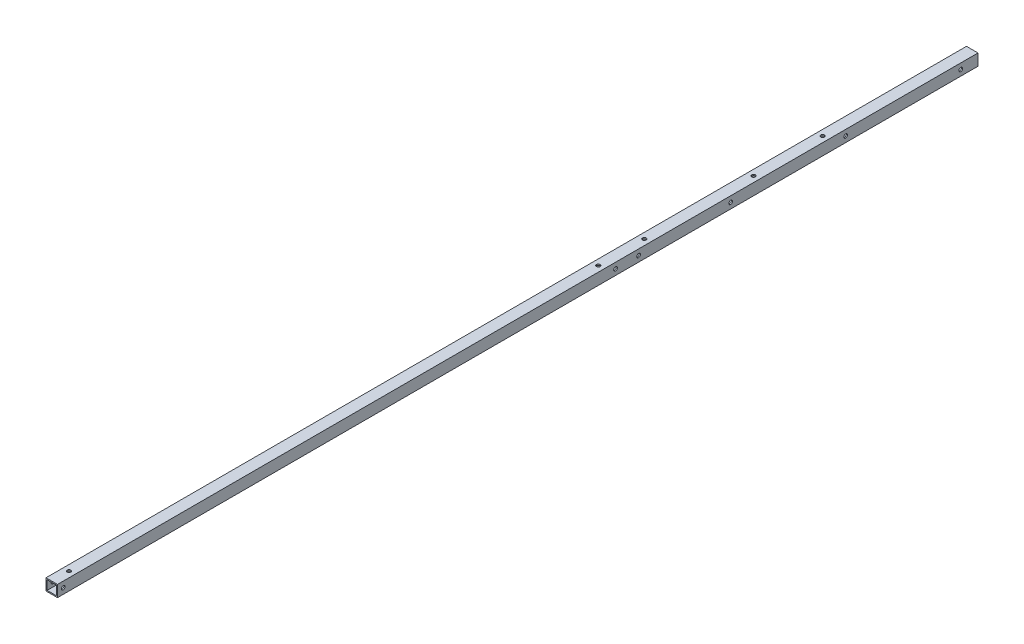
ISO-10303-21;
HEADER;
FILE_DESCRIPTION(('STEP AP214'),'2;1');
FILE_NAME('part.step','',(''),(''),'','','');
FILE_SCHEMA(('AUTOMOTIVE_DESIGN { 1 0 10303 214 1 1 1 1 }'));
ENDSEC;
DATA;
#1=APPLICATION_CONTEXT('core data for automotive mechanical design processes');
#2=APPLICATION_PROTOCOL_DEFINITION('international standard','automotive_design',2000,#1);
#3=PRODUCT_CONTEXT('',#1,'mechanical');
#4=PRODUCT('Part','Part','',(#3));
#5=PRODUCT_RELATED_PRODUCT_CATEGORY('part','',(#4));
#6=PRODUCT_DEFINITION_FORMATION('','',#4);
#7=PRODUCT_DEFINITION_CONTEXT('part definition',#1,'design');
#8=PRODUCT_DEFINITION('design','',#6,#7);
#9=PRODUCT_DEFINITION_SHAPE('','',#8);
#10=(LENGTH_UNIT() NAMED_UNIT(*) SI_UNIT(.MILLI.,.METRE.));
#11=(NAMED_UNIT(*) PLANE_ANGLE_UNIT() SI_UNIT($,.RADIAN.));
#12=(NAMED_UNIT(*) SI_UNIT($,.STERADIAN.) SOLID_ANGLE_UNIT());
#13=UNCERTAINTY_MEASURE_WITH_UNIT(LENGTH_MEASURE(1.E-05),#10,'distance_accuracy_value','');
#14=(GEOMETRIC_REPRESENTATION_CONTEXT(3) GLOBAL_UNCERTAINTY_ASSIGNED_CONTEXT((#13)) GLOBAL_UNIT_ASSIGNED_CONTEXT((#10,
#11,#12)) REPRESENTATION_CONTEXT('',''));
#15=CARTESIAN_POINT('',(0.,0.,0.));
#16=DIRECTION('',(0.,0.,1.));
#17=DIRECTION('',(1.,0.,0.));
#18=AXIS2_PLACEMENT_3D('',#15,#16,#17);
#19=CARTESIAN_POINT('',(0.,0.,800.));
#20=DIRECTION('',(0.,0.,-1.));
#21=DIRECTION('',(-1.,0.,0.));
#22=AXIS2_PLACEMENT_3D('',#19,#20,#21);
#23=PLANE('',#22);
#24=DIRECTION('',(0.,1.,0.));
#25=VECTOR('',#24,1.);
#26=CARTESIAN_POINT('',(5.,-5.,800.));
#27=LINE('',#26,#25);
#28=CARTESIAN_POINT('',(5.,-5.,800.));
#29=VERTEX_POINT('',#28);
#30=CARTESIAN_POINT('',(5.,5.,800.));
#31=VERTEX_POINT('',#30);
#32=EDGE_CURVE('E140',#29,#31,#27,.T.);
#33=ORIENTED_EDGE('',*,*,#32,.T.);
#34=DIRECTION('',(-1.,0.,0.));
#35=VECTOR('',#34,1.);
#36=CARTESIAN_POINT('',(-5.,5.,800.));
#37=LINE('',#36,#35);
#38=CARTESIAN_POINT('',(-5.,5.,800.));
#39=VERTEX_POINT('',#38);
#40=EDGE_CURVE('E143',#31,#39,#37,.T.);
#41=ORIENTED_EDGE('',*,*,#40,.T.);
#42=DIRECTION('',(0.,-1.,0.));
#43=VECTOR('',#42,1.);
#44=CARTESIAN_POINT('',(-5.,-5.,800.));
#45=LINE('',#44,#43);
#46=CARTESIAN_POINT('',(-5.,-5.,800.));
#47=VERTEX_POINT('',#46);
#48=EDGE_CURVE('E146',#39,#47,#45,.T.);
#49=ORIENTED_EDGE('',*,*,#48,.T.);
#50=DIRECTION('',(1.,0.,0.));
#51=VECTOR('',#50,1.);
#52=CARTESIAN_POINT('',(-5.,-5.,800.));
#53=LINE('',#52,#51);
#54=EDGE_CURVE('E148',#47,#29,#53,.T.);
#55=ORIENTED_EDGE('',*,*,#54,.T.);
#56=EDGE_LOOP('',(#33,#41,#49,#55));
#57=FACE_BOUND('',#56,.T.);
#58=DIRECTION('',(0.,1.,0.));
#59=VECTOR('',#58,1.);
#60=CARTESIAN_POINT('',(4.,-4.,800.));
#61=LINE('',#60,#59);
#62=CARTESIAN_POINT('',(4.,-4.,800.));
#63=VERTEX_POINT('',#62);
#64=CARTESIAN_POINT('',(4.,4.,800.));
#65=VERTEX_POINT('',#64);
#66=EDGE_CURVE('E102',#63,#65,#61,.T.);
#67=ORIENTED_EDGE('',*,*,#66,.F.);
#68=DIRECTION('',(1.,0.,0.));
#69=VECTOR('',#68,1.);
#70=CARTESIAN_POINT('',(-4.,-4.,800.));
#71=LINE('',#70,#69);
#72=CARTESIAN_POINT('',(-4.,-4.,800.));
#73=VERTEX_POINT('',#72);
#74=EDGE_CURVE('E124',#73,#63,#71,.T.);
#75=ORIENTED_EDGE('',*,*,#74,.F.);
#76=DIRECTION('',(0.,-1.,0.));
#77=VECTOR('',#76,1.);
#78=CARTESIAN_POINT('',(-4.,-4.,800.));
#79=LINE('',#78,#77);
#80=CARTESIAN_POINT('',(-4.,4.,800.));
#81=VERTEX_POINT('',#80);
#82=EDGE_CURVE('E122',#81,#73,#79,.T.);
#83=ORIENTED_EDGE('',*,*,#82,.F.);
#84=DIRECTION('',(-1.,0.,0.));
#85=VECTOR('',#84,1.);
#86=CARTESIAN_POINT('',(-4.,4.,800.));
#87=LINE('',#86,#85);
#88=EDGE_CURVE('E110',#65,#81,#87,.T.);
#89=ORIENTED_EDGE('',*,*,#88,.F.);
#90=EDGE_LOOP('',(#67,#75,#83,#89));
#91=FACE_BOUND('',#90,.T.);
#92=ADVANCED_FACE('F35',(#57,#91),#23,.F.);
#93=CARTESIAN_POINT('',(0.,0.,0.));
#94=DIRECTION('',(0.,0.,-1.));
#95=DIRECTION('',(-1.,0.,0.));
#96=AXIS2_PLACEMENT_3D('',#93,#94,#95);
#97=PLANE('',#96);
#98=DIRECTION('',(0.,1.,0.));
#99=VECTOR('',#98,1.);
#100=CARTESIAN_POINT('',(5.,-5.,0.));
#101=LINE('',#100,#99);
#102=CARTESIAN_POINT('',(5.,-5.,0.));
#103=VERTEX_POINT('',#102);
#104=CARTESIAN_POINT('',(5.,5.,0.));
#105=VERTEX_POINT('',#104);
#106=EDGE_CURVE('E118',#103,#105,#101,.T.);
#107=ORIENTED_EDGE('',*,*,#106,.F.);
#108=DIRECTION('',(1.,0.,0.));
#109=VECTOR('',#108,1.);
#110=CARTESIAN_POINT('',(-5.,-5.,0.));
#111=LINE('',#110,#109);
#112=CARTESIAN_POINT('',(-5.,-5.,0.));
#113=VERTEX_POINT('',#112);
#114=EDGE_CURVE('E144',#113,#103,#111,.T.);
#115=ORIENTED_EDGE('',*,*,#114,.F.);
#116=DIRECTION('',(0.,-1.,0.));
#117=VECTOR('',#116,1.);
#118=CARTESIAN_POINT('',(-5.,-5.,0.));
#119=LINE('',#118,#117);
#120=CARTESIAN_POINT('',(-5.,5.,0.));
#121=VERTEX_POINT('',#120);
#122=EDGE_CURVE('E155',#121,#113,#119,.T.);
#123=ORIENTED_EDGE('',*,*,#122,.F.);
#124=DIRECTION('',(-1.,0.,0.));
#125=VECTOR('',#124,1.);
#126=CARTESIAN_POINT('',(-5.,5.,0.));
#127=LINE('',#126,#125);
#128=EDGE_CURVE('E153',#105,#121,#127,.T.);
#129=ORIENTED_EDGE('',*,*,#128,.F.);
#130=EDGE_LOOP('',(#107,#115,#123,#129));
#131=FACE_BOUND('',#130,.T.);
#132=DIRECTION('',(1.,0.,0.));
#133=VECTOR('',#132,1.);
#134=CARTESIAN_POINT('',(-4.,-4.,0.));
#135=LINE('',#134,#133);
#136=CARTESIAN_POINT('',(-4.,-4.,0.));
#137=VERTEX_POINT('',#136);
#138=CARTESIAN_POINT('',(4.,-4.,0.));
#139=VERTEX_POINT('',#138);
#140=EDGE_CURVE('E111',#137,#139,#135,.T.);
#141=ORIENTED_EDGE('',*,*,#140,.T.);
#142=DIRECTION('',(0.,1.,0.));
#143=VECTOR('',#142,1.);
#144=CARTESIAN_POINT('',(4.,-4.,0.));
#145=LINE('',#144,#143);
#146=CARTESIAN_POINT('',(4.,4.,0.));
#147=VERTEX_POINT('',#146);
#148=EDGE_CURVE('E60',#139,#147,#145,.T.);
#149=ORIENTED_EDGE('',*,*,#148,.T.);
#150=DIRECTION('',(-1.,0.,0.));
#151=VECTOR('',#150,1.);
#152=CARTESIAN_POINT('',(-4.,4.,0.));
#153=LINE('',#152,#151);
#154=CARTESIAN_POINT('',(-4.,4.,0.));
#155=VERTEX_POINT('',#154);
#156=EDGE_CURVE('E117',#147,#155,#153,.T.);
#157=ORIENTED_EDGE('',*,*,#156,.T.);
#158=DIRECTION('',(0.,-1.,0.));
#159=VECTOR('',#158,1.);
#160=CARTESIAN_POINT('',(-4.,-4.,0.));
#161=LINE('',#160,#159);
#162=EDGE_CURVE('E132',#155,#137,#161,.T.);
#163=ORIENTED_EDGE('',*,*,#162,.T.);
#164=EDGE_LOOP('',(#141,#149,#157,#163));
#165=FACE_BOUND('',#164,.T.);
#166=ADVANCED_FACE('F320',(#131,#165),#97,.T.);
#167=CARTESIAN_POINT('',(5.,-5.,800.));
#168=DIRECTION('',(-1.,0.,0.));
#169=DIRECTION('',(0.,0.,1.));
#170=AXIS2_PLACEMENT_3D('',#167,#168,#169);
#171=PLANE('',#170);
#172=CARTESIAN_POINT('',(5.,0.,115.));
#173=DIRECTION('',(1.,0.,0.));
#174=DIRECTION('',(0.,0.,-1.));
#175=AXIS2_PLACEMENT_3D('',#172,#173,#174);
#176=CIRCLE('',#175,1.6);
#177=CARTESIAN_POINT('',(5.,0.,113.4));
#178=VERTEX_POINT('',#177);
#179=EDGE_CURVE('E396',#178,#178,#176,.T.);
#180=ORIENTED_EDGE('',*,*,#179,.F.);
#181=EDGE_LOOP('',(#180));
#182=FACE_BOUND('',#181,.T.);
#183=CARTESIAN_POINT('',(5.,0.,215.));
#184=DIRECTION('',(1.,0.,0.));
#185=DIRECTION('',(0.,0.,-1.));
#186=AXIS2_PLACEMENT_3D('',#183,#184,#185);
#187=CIRCLE('',#186,1.6);
#188=CARTESIAN_POINT('',(5.,0.,213.4));
#189=VERTEX_POINT('',#188);
#190=EDGE_CURVE('E400',#189,#189,#187,.T.);
#191=ORIENTED_EDGE('',*,*,#190,.F.);
#192=EDGE_LOOP('',(#191));
#193=FACE_BOUND('',#192,.T.);
#194=CARTESIAN_POINT('',(5.,0.,315.));
#195=DIRECTION('',(1.,0.,0.));
#196=DIRECTION('',(0.,0.,-1.));
#197=AXIS2_PLACEMENT_3D('',#194,#195,#196);
#198=CIRCLE('',#197,1.6);
#199=CARTESIAN_POINT('',(5.,0.,313.4));
#200=VERTEX_POINT('',#199);
#201=EDGE_CURVE('E215',#200,#200,#198,.T.);
#202=ORIENTED_EDGE('',*,*,#201,.F.);
#203=EDGE_LOOP('',(#202));
#204=FACE_BOUND('',#203,.T.);
#205=CARTESIAN_POINT('',(5.,0.,15.));
#206=DIRECTION('',(1.,0.,0.));
#207=DIRECTION('',(0.,0.,-1.));
#208=AXIS2_PLACEMENT_3D('',#205,#206,#207);
#209=CIRCLE('',#208,1.6);
#210=CARTESIAN_POINT('',(5.,0.,13.4));
#211=VERTEX_POINT('',#210);
#212=EDGE_CURVE('E221',#211,#211,#209,.T.);
#213=ORIENTED_EDGE('',*,*,#212,.F.);
#214=EDGE_LOOP('',(#213));
#215=FACE_BOUND('',#214,.T.);
#216=CARTESIAN_POINT('',(5.,0.,795.));
#217=DIRECTION('',(-1.,0.,0.));
#218=DIRECTION('',(0.,0.,1.));
#219=AXIS2_PLACEMENT_3D('',#216,#217,#218);
#220=CIRCLE('',#219,1.60000000000002);
#221=CARTESIAN_POINT('',(5.,0.,796.6));
#222=VERTEX_POINT('',#221);
#223=EDGE_CURVE('E189',#222,#222,#220,.T.);
#224=ORIENTED_EDGE('',*,*,#223,.T.);
#225=EDGE_LOOP('',(#224));
#226=FACE_BOUND('',#225,.T.);
#227=CARTESIAN_POINT('',(5.,0.,295.));
#228=DIRECTION('',(-1.,0.,0.));
#229=DIRECTION('',(0.,0.,1.));
#230=AXIS2_PLACEMENT_3D('',#227,#228,#229);
#231=CIRCLE('',#230,1.60000000000002);
#232=CARTESIAN_POINT('',(5.,0.,296.6));
#233=VERTEX_POINT('',#232);
#234=EDGE_CURVE('E234',#233,#233,#231,.T.);
#235=ORIENTED_EDGE('',*,*,#234,.T.);
#236=EDGE_LOOP('',(#235));
#237=FACE_BOUND('',#236,.T.);
#238=ORIENTED_EDGE('',*,*,#106,.T.);
#239=DIRECTION('',(0.,0.,-1.));
#240=VECTOR('',#239,1.);
#241=CARTESIAN_POINT('',(5.,5.,800.));
#242=LINE('',#241,#240);
#243=EDGE_CURVE('E11',#31,#105,#242,.T.);
#244=ORIENTED_EDGE('',*,*,#243,.F.);
#245=ORIENTED_EDGE('',*,*,#32,.F.);
#246=DIRECTION('',(0.,0.,-1.));
#247=VECTOR('',#246,1.);
#248=CARTESIAN_POINT('',(5.,-5.,800.));
#249=LINE('',#248,#247);
#250=EDGE_CURVE('E150',#29,#103,#249,.T.);
#251=ORIENTED_EDGE('',*,*,#250,.T.);
#252=EDGE_LOOP('',(#238,#244,#245,#251));
#253=FACE_BOUND('',#252,.T.);
#254=ADVANCED_FACE('F37',(#182,#193,#204,#215,#226,#237,#253),#171,.F.);
#255=CARTESIAN_POINT('',(-5.,5.,800.));
#256=DIRECTION('',(0.,-1.,0.));
#257=DIRECTION('',(0.,0.,-1.));
#258=AXIS2_PLACEMENT_3D('',#255,#256,#257);
#259=PLANE('',#258);
#260=CARTESIAN_POINT('',(0.,5.,785.));
#261=DIRECTION('',(0.,1.,0.));
#262=DIRECTION('',(0.,0.,1.));
#263=AXIS2_PLACEMENT_3D('',#260,#261,#262);
#264=CIRCLE('',#263,1.60000000000004);
#265=CARTESIAN_POINT('',(0.,5.,786.6));
#266=VERTEX_POINT('',#265);
#267=EDGE_CURVE('E246',#266,#266,#264,.T.);
#268=ORIENTED_EDGE('',*,*,#267,.F.);
#269=EDGE_LOOP('',(#268));
#270=FACE_BOUND('',#269,.T.);
#271=CARTESIAN_POINT('',(0.,5.,190.));
#272=DIRECTION('',(0.,1.,0.));
#273=DIRECTION('',(0.,0.,1.));
#274=AXIS2_PLACEMENT_3D('',#271,#272,#273);
#275=CIRCLE('',#274,1.59999999999998);
#276=CARTESIAN_POINT('',(0.,5.,191.6));
#277=VERTEX_POINT('',#276);
#278=EDGE_CURVE('E252',#277,#277,#275,.T.);
#279=ORIENTED_EDGE('',*,*,#278,.F.);
#280=EDGE_LOOP('',(#279));
#281=FACE_BOUND('',#280,.T.);
#282=CARTESIAN_POINT('',(0.,5.,130.));
#283=DIRECTION('',(0.,1.,0.));
#284=DIRECTION('',(0.,0.,1.));
#285=AXIS2_PLACEMENT_3D('',#282,#283,#284);
#286=CIRCLE('',#285,1.59999999999999);
#287=CARTESIAN_POINT('',(0.,5.,131.6));
#288=VERTEX_POINT('',#287);
#289=EDGE_CURVE('E258',#288,#288,#286,.T.);
#290=ORIENTED_EDGE('',*,*,#289,.F.);
#291=EDGE_LOOP('',(#290));
#292=FACE_BOUND('',#291,.T.);
#293=CARTESIAN_POINT('',(0.,5.,325.));
#294=DIRECTION('',(0.,1.,0.));
#295=DIRECTION('',(0.,0.,1.));
#296=AXIS2_PLACEMENT_3D('',#293,#294,#295);
#297=CIRCLE('',#296,1.59999999999999);
#298=CARTESIAN_POINT('',(0.,5.,326.6));
#299=VERTEX_POINT('',#298);
#300=EDGE_CURVE('E264',#299,#299,#297,.T.);
#301=ORIENTED_EDGE('',*,*,#300,.F.);
#302=EDGE_LOOP('',(#301));
#303=FACE_BOUND('',#302,.T.);
#304=CARTESIAN_POINT('',(0.,5.,285.));
#305=DIRECTION('',(0.,1.,0.));
#306=DIRECTION('',(0.,0.,1.));
#307=AXIS2_PLACEMENT_3D('',#304,#305,#306);
#308=CIRCLE('',#307,1.59999999999999);
#309=CARTESIAN_POINT('',(0.,5.,286.6));
#310=VERTEX_POINT('',#309);
#311=EDGE_CURVE('E243',#310,#310,#308,.T.);
#312=ORIENTED_EDGE('',*,*,#311,.F.);
#313=EDGE_LOOP('',(#312));
#314=FACE_BOUND('',#313,.T.);
#315=ORIENTED_EDGE('',*,*,#128,.T.);
#316=DIRECTION('',(0.,0.,-1.));
#317=VECTOR('',#316,1.);
#318=CARTESIAN_POINT('',(-5.,5.,800.));
#319=LINE('',#318,#317);
#320=EDGE_CURVE('E44',#39,#121,#319,.T.);
#321=ORIENTED_EDGE('',*,*,#320,.F.);
#322=ORIENTED_EDGE('',*,*,#40,.F.);
#323=ORIENTED_EDGE('',*,*,#243,.T.);
#324=EDGE_LOOP('',(#315,#321,#322,#323));
#325=FACE_BOUND('',#324,.T.);
#326=ADVANCED_FACE('F306',(#270,#281,#292,#303,#314,#325),#259,.F.);
#327=CARTESIAN_POINT('',(-5.,-5.,800.));
#328=DIRECTION('',(1.,0.,0.));
#329=DIRECTION('',(0.,0.,-1.));
#330=AXIS2_PLACEMENT_3D('',#327,#328,#329);
#331=PLANE('',#330);
#332=CARTESIAN_POINT('',(-5.,0.,115.));
#333=DIRECTION('',(1.,0.,0.));
#334=DIRECTION('',(0.,0.,-1.));
#335=AXIS2_PLACEMENT_3D('',#332,#333,#334);
#336=CIRCLE('',#335,1.6);
#337=CARTESIAN_POINT('',(-5.,0.,113.4));
#338=VERTEX_POINT('',#337);
#339=EDGE_CURVE('E202',#338,#338,#336,.T.);
#340=ORIENTED_EDGE('',*,*,#339,.T.);
#341=EDGE_LOOP('',(#340));
#342=FACE_BOUND('',#341,.T.);
#343=CARTESIAN_POINT('',(-5.,0.,215.));
#344=DIRECTION('',(1.,0.,0.));
#345=DIRECTION('',(0.,0.,-1.));
#346=AXIS2_PLACEMENT_3D('',#343,#344,#345);
#347=CIRCLE('',#346,1.6);
#348=CARTESIAN_POINT('',(-5.,0.,213.4));
#349=VERTEX_POINT('',#348);
#350=EDGE_CURVE('E352',#349,#349,#347,.T.);
#351=ORIENTED_EDGE('',*,*,#350,.T.);
#352=EDGE_LOOP('',(#351));
#353=FACE_BOUND('',#352,.T.);
#354=CARTESIAN_POINT('',(-5.,0.,315.));
#355=DIRECTION('',(1.,0.,0.));
#356=DIRECTION('',(0.,0.,-1.));
#357=AXIS2_PLACEMENT_3D('',#354,#355,#356);
#358=CIRCLE('',#357,1.6);
#359=CARTESIAN_POINT('',(-5.,0.,313.4));
#360=VERTEX_POINT('',#359);
#361=EDGE_CURVE('E356',#360,#360,#358,.T.);
#362=ORIENTED_EDGE('',*,*,#361,.T.);
#363=EDGE_LOOP('',(#362));
#364=FACE_BOUND('',#363,.T.);
#365=CARTESIAN_POINT('',(-5.,0.,15.));
#366=DIRECTION('',(1.,0.,0.));
#367=DIRECTION('',(0.,0.,-1.));
#368=AXIS2_PLACEMENT_3D('',#365,#366,#367);
#369=CIRCLE('',#368,1.6);
#370=CARTESIAN_POINT('',(-5.,0.,13.4));
#371=VERTEX_POINT('',#370);
#372=EDGE_CURVE('E198',#371,#371,#369,.T.);
#373=ORIENTED_EDGE('',*,*,#372,.T.);
#374=EDGE_LOOP('',(#373));
#375=FACE_BOUND('',#374,.T.);
#376=CARTESIAN_POINT('',(-5.,0.,795.));
#377=DIRECTION('',(-1.,0.,0.));
#378=DIRECTION('',(0.,0.,1.));
#379=AXIS2_PLACEMENT_3D('',#376,#377,#378);
#380=CIRCLE('',#379,1.60000000000002);
#381=CARTESIAN_POINT('',(-5.,0.,796.6));
#382=VERTEX_POINT('',#381);
#383=EDGE_CURVE('E231',#382,#382,#380,.T.);
#384=ORIENTED_EDGE('',*,*,#383,.F.);
#385=EDGE_LOOP('',(#384));
#386=FACE_BOUND('',#385,.T.);
#387=CARTESIAN_POINT('',(-5.,0.,295.));
#388=DIRECTION('',(-1.,0.,0.));
#389=DIRECTION('',(0.,0.,1.));
#390=AXIS2_PLACEMENT_3D('',#387,#388,#389);
#391=CIRCLE('',#390,1.60000000000002);
#392=CARTESIAN_POINT('',(-5.,0.,296.6));
#393=VERTEX_POINT('',#392);
#394=EDGE_CURVE('E228',#393,#393,#391,.T.);
#395=ORIENTED_EDGE('',*,*,#394,.F.);
#396=EDGE_LOOP('',(#395));
#397=FACE_BOUND('',#396,.T.);
#398=ORIENTED_EDGE('',*,*,#122,.T.);
#399=DIRECTION('',(0.,0.,-1.));
#400=VECTOR('',#399,1.);
#401=CARTESIAN_POINT('',(-5.,-5.,800.));
#402=LINE('',#401,#400);
#403=EDGE_CURVE('E160',#47,#113,#402,.T.);
#404=ORIENTED_EDGE('',*,*,#403,.F.);
#405=ORIENTED_EDGE('',*,*,#48,.F.);
#406=ORIENTED_EDGE('',*,*,#320,.T.);
#407=EDGE_LOOP('',(#398,#404,#405,#406));
#408=FACE_BOUND('',#407,.T.);
#409=ADVANCED_FACE('F309',(#342,#353,#364,#375,#386,#397,#408),#331,.F.);
#410=CARTESIAN_POINT('',(-5.,-5.,800.));
#411=DIRECTION('',(0.,1.,0.));
#412=DIRECTION('',(0.,0.,1.));
#413=AXIS2_PLACEMENT_3D('',#410,#411,#412);
#414=PLANE('',#413);
#415=CARTESIAN_POINT('',(0.,-5.,785.));
#416=DIRECTION('',(0.,1.,0.));
#417=DIRECTION('',(0.,0.,1.));
#418=AXIS2_PLACEMENT_3D('',#415,#416,#417);
#419=CIRCLE('',#418,1.60000000000004);
#420=CARTESIAN_POINT('',(0.,-5.,786.6));
#421=VERTEX_POINT('',#420);
#422=EDGE_CURVE('E169',#421,#421,#419,.T.);
#423=ORIENTED_EDGE('',*,*,#422,.T.);
#424=EDGE_LOOP('',(#423));
#425=FACE_BOUND('',#424,.T.);
#426=CARTESIAN_POINT('',(0.,-5.,190.));
#427=DIRECTION('',(0.,1.,0.));
#428=DIRECTION('',(0.,0.,1.));
#429=AXIS2_PLACEMENT_3D('',#426,#427,#428);
#430=CIRCLE('',#429,1.59999999999998);
#431=CARTESIAN_POINT('',(0.,-5.,191.6));
#432=VERTEX_POINT('',#431);
#433=EDGE_CURVE('E249',#432,#432,#430,.T.);
#434=ORIENTED_EDGE('',*,*,#433,.T.);
#435=EDGE_LOOP('',(#434));
#436=FACE_BOUND('',#435,.T.);
#437=CARTESIAN_POINT('',(0.,-5.,130.));
#438=DIRECTION('',(0.,1.,0.));
#439=DIRECTION('',(0.,0.,1.));
#440=AXIS2_PLACEMENT_3D('',#437,#438,#439);
#441=CIRCLE('',#440,1.59999999999999);
#442=CARTESIAN_POINT('',(0.,-5.,131.6));
#443=VERTEX_POINT('',#442);
#444=EDGE_CURVE('E255',#443,#443,#441,.T.);
#445=ORIENTED_EDGE('',*,*,#444,.T.);
#446=EDGE_LOOP('',(#445));
#447=FACE_BOUND('',#446,.T.);
#448=CARTESIAN_POINT('',(0.,-5.,325.));
#449=DIRECTION('',(0.,1.,0.));
#450=DIRECTION('',(0.,0.,1.));
#451=AXIS2_PLACEMENT_3D('',#448,#449,#450);
#452=CIRCLE('',#451,1.59999999999999);
#453=CARTESIAN_POINT('',(0.,-5.,326.6));
#454=VERTEX_POINT('',#453);
#455=EDGE_CURVE('E261',#454,#454,#452,.T.);
#456=ORIENTED_EDGE('',*,*,#455,.T.);
#457=EDGE_LOOP('',(#456));
#458=FACE_BOUND('',#457,.T.);
#459=CARTESIAN_POINT('',(0.,-5.,285.));
#460=DIRECTION('',(0.,1.,0.));
#461=DIRECTION('',(0.,0.,1.));
#462=AXIS2_PLACEMENT_3D('',#459,#460,#461);
#463=CIRCLE('',#462,1.59999999999999);
#464=CARTESIAN_POINT('',(0.,-5.,286.6));
#465=VERTEX_POINT('',#464);
#466=EDGE_CURVE('E267',#465,#465,#463,.T.);
#467=ORIENTED_EDGE('',*,*,#466,.T.);
#468=EDGE_LOOP('',(#467));
#469=FACE_BOUND('',#468,.T.);
#470=ORIENTED_EDGE('',*,*,#114,.T.);
#471=ORIENTED_EDGE('',*,*,#250,.F.);
#472=ORIENTED_EDGE('',*,*,#54,.F.);
#473=ORIENTED_EDGE('',*,*,#403,.T.);
#474=EDGE_LOOP('',(#470,#471,#472,#473));
#475=FACE_BOUND('',#474,.T.);
#476=ADVANCED_FACE('F324',(#425,#436,#447,#458,#469,#475),#414,.F.);
#477=CARTESIAN_POINT('',(4.,-4.,800.));
#478=DIRECTION('',(-1.,0.,0.));
#479=DIRECTION('',(0.,0.,1.));
#480=AXIS2_PLACEMENT_3D('',#477,#478,#479);
#481=PLANE('',#480);
#482=CARTESIAN_POINT('',(4.,0.,115.));
#483=DIRECTION('',(-1.,0.,0.));
#484=DIRECTION('',(0.,0.,1.));
#485=AXIS2_PLACEMENT_3D('',#482,#483,#484);
#486=CIRCLE('',#485,1.6);
#487=CARTESIAN_POINT('',(4.,0.,116.6));
#488=VERTEX_POINT('',#487);
#489=EDGE_CURVE('E218',#488,#488,#486,.T.);
#490=ORIENTED_EDGE('',*,*,#489,.F.);
#491=EDGE_LOOP('',(#490));
#492=FACE_BOUND('',#491,.T.);
#493=CARTESIAN_POINT('',(4.,0.,215.));
#494=DIRECTION('',(-1.,0.,0.));
#495=DIRECTION('',(0.,0.,1.));
#496=AXIS2_PLACEMENT_3D('',#493,#494,#495);
#497=CIRCLE('',#496,1.6);
#498=CARTESIAN_POINT('',(4.,0.,216.6));
#499=VERTEX_POINT('',#498);
#500=EDGE_CURVE('E205',#499,#499,#497,.T.);
#501=ORIENTED_EDGE('',*,*,#500,.F.);
#502=EDGE_LOOP('',(#501));
#503=FACE_BOUND('',#502,.T.);
#504=CARTESIAN_POINT('',(4.,0.,315.));
#505=DIRECTION('',(-1.,0.,0.));
#506=DIRECTION('',(0.,0.,1.));
#507=AXIS2_PLACEMENT_3D('',#504,#505,#506);
#508=CIRCLE('',#507,1.6);
#509=CARTESIAN_POINT('',(4.,0.,316.6));
#510=VERTEX_POINT('',#509);
#511=EDGE_CURVE('E201',#510,#510,#508,.T.);
#512=ORIENTED_EDGE('',*,*,#511,.F.);
#513=EDGE_LOOP('',(#512));
#514=FACE_BOUND('',#513,.T.);
#515=CARTESIAN_POINT('',(4.,0.,15.));
#516=DIRECTION('',(-1.,0.,0.));
#517=DIRECTION('',(0.,0.,1.));
#518=AXIS2_PLACEMENT_3D('',#515,#516,#517);
#519=CIRCLE('',#518,1.6);
#520=CARTESIAN_POINT('',(4.,0.,16.6));
#521=VERTEX_POINT('',#520);
#522=EDGE_CURVE('E197',#521,#521,#519,.T.);
#523=ORIENTED_EDGE('',*,*,#522,.F.);
#524=EDGE_LOOP('',(#523));
#525=FACE_BOUND('',#524,.T.);
#526=CARTESIAN_POINT('',(4.,0.,795.));
#527=DIRECTION('',(-1.,0.,0.));
#528=DIRECTION('',(0.,0.,1.));
#529=AXIS2_PLACEMENT_3D('',#526,#527,#528);
#530=CIRCLE('',#529,1.60000000000002);
#531=CARTESIAN_POINT('',(4.,0.,796.6));
#532=VERTEX_POINT('',#531);
#533=EDGE_CURVE('E193',#532,#532,#530,.T.);
#534=ORIENTED_EDGE('',*,*,#533,.F.);
#535=EDGE_LOOP('',(#534));
#536=FACE_BOUND('',#535,.T.);
#537=CARTESIAN_POINT('',(4.,0.,295.));
#538=DIRECTION('',(-1.,0.,0.));
#539=DIRECTION('',(0.,0.,1.));
#540=AXIS2_PLACEMENT_3D('',#537,#538,#539);
#541=CIRCLE('',#540,1.60000000000002);
#542=CARTESIAN_POINT('',(4.,0.,296.6));
#543=VERTEX_POINT('',#542);
#544=EDGE_CURVE('E188',#543,#543,#541,.T.);
#545=ORIENTED_EDGE('',*,*,#544,.F.);
#546=EDGE_LOOP('',(#545));
#547=FACE_BOUND('',#546,.T.);
#548=ORIENTED_EDGE('',*,*,#148,.F.);
#549=DIRECTION('',(0.,0.,-1.));
#550=VECTOR('',#549,1.);
#551=CARTESIAN_POINT('',(4.,-4.,800.));
#552=LINE('',#551,#550);
#553=EDGE_CURVE('E106',#63,#139,#552,.T.);
#554=ORIENTED_EDGE('',*,*,#553,.F.);
#555=ORIENTED_EDGE('',*,*,#66,.T.);
#556=DIRECTION('',(0.,0.,-1.));
#557=VECTOR('',#556,1.);
#558=CARTESIAN_POINT('',(4.,4.,800.));
#559=LINE('',#558,#557);
#560=EDGE_CURVE('E105',#65,#147,#559,.T.);
#561=ORIENTED_EDGE('',*,*,#560,.T.);
#562=EDGE_LOOP('',(#548,#554,#555,#561));
#563=FACE_BOUND('',#562,.T.);
#564=ADVANCED_FACE('F104',(#492,#503,#514,#525,#536,#547,#563),#481,.T.);
#565=CARTESIAN_POINT('',(-4.,4.,800.));
#566=DIRECTION('',(0.,-1.,0.));
#567=DIRECTION('',(0.,0.,-1.));
#568=AXIS2_PLACEMENT_3D('',#565,#566,#567);
#569=PLANE('',#568);
#570=CARTESIAN_POINT('',(0.,4.,785.));
#571=DIRECTION('',(0.,-1.,0.));
#572=DIRECTION('',(0.,0.,-1.));
#573=AXIS2_PLACEMENT_3D('',#570,#571,#572);
#574=CIRCLE('',#573,1.60000000000004);
#575=CARTESIAN_POINT('',(0.,4.,783.4));
#576=VERTEX_POINT('',#575);
#577=EDGE_CURVE('E130',#576,#576,#574,.T.);
#578=ORIENTED_EDGE('',*,*,#577,.F.);
#579=EDGE_LOOP('',(#578));
#580=FACE_BOUND('',#579,.T.);
#581=CARTESIAN_POINT('',(0.,4.,190.));
#582=DIRECTION('',(0.,-1.,0.));
#583=DIRECTION('',(0.,0.,-1.));
#584=AXIS2_PLACEMENT_3D('',#581,#582,#583);
#585=CIRCLE('',#584,1.59999999999998);
#586=CARTESIAN_POINT('',(0.,4.,188.4));
#587=VERTEX_POINT('',#586);
#588=EDGE_CURVE('E181',#587,#587,#585,.T.);
#589=ORIENTED_EDGE('',*,*,#588,.F.);
#590=EDGE_LOOP('',(#589));
#591=FACE_BOUND('',#590,.T.);
#592=CARTESIAN_POINT('',(0.,4.,130.));
#593=DIRECTION('',(0.,-1.,0.));
#594=DIRECTION('',(0.,0.,-1.));
#595=AXIS2_PLACEMENT_3D('',#592,#593,#594);
#596=CIRCLE('',#595,1.59999999999999);
#597=CARTESIAN_POINT('',(0.,4.,128.4));
#598=VERTEX_POINT('',#597);
#599=EDGE_CURVE('E177',#598,#598,#596,.T.);
#600=ORIENTED_EDGE('',*,*,#599,.F.);
#601=EDGE_LOOP('',(#600));
#602=FACE_BOUND('',#601,.T.);
#603=CARTESIAN_POINT('',(0.,4.,325.));
#604=DIRECTION('',(0.,-1.,0.));
#605=DIRECTION('',(0.,0.,-1.));
#606=AXIS2_PLACEMENT_3D('',#603,#604,#605);
#607=CIRCLE('',#606,1.59999999999999);
#608=CARTESIAN_POINT('',(0.,4.,323.4));
#609=VERTEX_POINT('',#608);
#610=EDGE_CURVE('E173',#609,#609,#607,.T.);
#611=ORIENTED_EDGE('',*,*,#610,.F.);
#612=EDGE_LOOP('',(#611));
#613=FACE_BOUND('',#612,.T.);
#614=CARTESIAN_POINT('',(0.,4.,285.));
#615=DIRECTION('',(0.,-1.,0.));
#616=DIRECTION('',(0.,0.,-1.));
#617=AXIS2_PLACEMENT_3D('',#614,#615,#616);
#618=CIRCLE('',#617,1.59999999999999);
#619=CARTESIAN_POINT('',(0.,4.,283.4));
#620=VERTEX_POINT('',#619);
#621=EDGE_CURVE('E168',#620,#620,#618,.T.);
#622=ORIENTED_EDGE('',*,*,#621,.F.);
#623=EDGE_LOOP('',(#622));
#624=FACE_BOUND('',#623,.T.);
#625=ORIENTED_EDGE('',*,*,#156,.F.);
#626=ORIENTED_EDGE('',*,*,#560,.F.);
#627=ORIENTED_EDGE('',*,*,#88,.T.);
#628=DIRECTION('',(0.,0.,-1.));
#629=VECTOR('',#628,1.);
#630=CARTESIAN_POINT('',(-4.,4.,800.));
#631=LINE('',#630,#629);
#632=EDGE_CURVE('E119',#81,#155,#631,.T.);
#633=ORIENTED_EDGE('',*,*,#632,.T.);
#634=EDGE_LOOP('',(#625,#626,#627,#633));
#635=FACE_BOUND('',#634,.T.);
#636=ADVANCED_FACE('F114',(#580,#591,#602,#613,#624,#635),#569,.T.);
#637=CARTESIAN_POINT('',(-4.,-4.,800.));
#638=DIRECTION('',(1.,0.,0.));
#639=DIRECTION('',(0.,0.,-1.));
#640=AXIS2_PLACEMENT_3D('',#637,#638,#639);
#641=PLANE('',#640);
#642=CARTESIAN_POINT('',(-4.,0.,115.));
#643=DIRECTION('',(1.,0.,0.));
#644=DIRECTION('',(0.,0.,-1.));
#645=AXIS2_PLACEMENT_3D('',#642,#643,#644);
#646=CIRCLE('',#645,1.6);
#647=CARTESIAN_POINT('',(-4.,0.,113.4));
#648=VERTEX_POINT('',#647);
#649=EDGE_CURVE('E39',#648,#648,#646,.T.);
#650=ORIENTED_EDGE('',*,*,#649,.F.);
#651=EDGE_LOOP('',(#650));
#652=FACE_BOUND('',#651,.T.);
#653=CARTESIAN_POINT('',(-4.,0.,215.));
#654=DIRECTION('',(1.,0.,0.));
#655=DIRECTION('',(0.,0.,-1.));
#656=AXIS2_PLACEMENT_3D('',#653,#654,#655);
#657=CIRCLE('',#656,1.6);
#658=CARTESIAN_POINT('',(-4.,0.,213.4));
#659=VERTEX_POINT('',#658);
#660=EDGE_CURVE('E203',#659,#659,#657,.T.);
#661=ORIENTED_EDGE('',*,*,#660,.F.);
#662=EDGE_LOOP('',(#661));
#663=FACE_BOUND('',#662,.T.);
#664=CARTESIAN_POINT('',(-4.,0.,315.));
#665=DIRECTION('',(1.,0.,0.));
#666=DIRECTION('',(0.,0.,-1.));
#667=AXIS2_PLACEMENT_3D('',#664,#665,#666);
#668=CIRCLE('',#667,1.6);
#669=CARTESIAN_POINT('',(-4.,0.,313.4));
#670=VERTEX_POINT('',#669);
#671=EDGE_CURVE('E199',#670,#670,#668,.T.);
#672=ORIENTED_EDGE('',*,*,#671,.F.);
#673=EDGE_LOOP('',(#672));
#674=FACE_BOUND('',#673,.T.);
#675=CARTESIAN_POINT('',(-4.,0.,15.));
#676=DIRECTION('',(1.,0.,0.));
#677=DIRECTION('',(0.,0.,-1.));
#678=AXIS2_PLACEMENT_3D('',#675,#676,#677);
#679=CIRCLE('',#678,1.6);
#680=CARTESIAN_POINT('',(-4.,0.,13.4));
#681=VERTEX_POINT('',#680);
#682=EDGE_CURVE('E194',#681,#681,#679,.T.);
#683=ORIENTED_EDGE('',*,*,#682,.F.);
#684=EDGE_LOOP('',(#683));
#685=FACE_BOUND('',#684,.T.);
#686=CARTESIAN_POINT('',(-4.,0.,795.));
#687=DIRECTION('',(1.,0.,0.));
#688=DIRECTION('',(0.,0.,-1.));
#689=AXIS2_PLACEMENT_3D('',#686,#687,#688);
#690=CIRCLE('',#689,1.60000000000002);
#691=CARTESIAN_POINT('',(-4.,0.,793.4));
#692=VERTEX_POINT('',#691);
#693=EDGE_CURVE('E190',#692,#692,#690,.T.);
#694=ORIENTED_EDGE('',*,*,#693,.F.);
#695=EDGE_LOOP('',(#694));
#696=FACE_BOUND('',#695,.T.);
#697=CARTESIAN_POINT('',(-4.,0.,295.));
#698=DIRECTION('',(1.,0.,0.));
#699=DIRECTION('',(0.,0.,-1.));
#700=AXIS2_PLACEMENT_3D('',#697,#698,#699);
#701=CIRCLE('',#700,1.60000000000002);
#702=CARTESIAN_POINT('',(-4.,0.,293.4));
#703=VERTEX_POINT('',#702);
#704=EDGE_CURVE('E185',#703,#703,#701,.T.);
#705=ORIENTED_EDGE('',*,*,#704,.F.);
#706=EDGE_LOOP('',(#705));
#707=FACE_BOUND('',#706,.T.);
#708=ORIENTED_EDGE('',*,*,#162,.F.);
#709=ORIENTED_EDGE('',*,*,#632,.F.);
#710=ORIENTED_EDGE('',*,*,#82,.T.);
#711=DIRECTION('',(0.,0.,-1.));
#712=VECTOR('',#711,1.);
#713=CARTESIAN_POINT('',(-4.,-4.,800.));
#714=LINE('',#713,#712);
#715=EDGE_CURVE('E52',#73,#137,#714,.T.);
#716=ORIENTED_EDGE('',*,*,#715,.T.);
#717=EDGE_LOOP('',(#708,#709,#710,#716));
#718=FACE_BOUND('',#717,.T.);
#719=ADVANCED_FACE('F287',(#652,#663,#674,#685,#696,#707,#718),#641,.T.);
#720=CARTESIAN_POINT('',(-4.,-4.,800.));
#721=DIRECTION('',(0.,1.,0.));
#722=DIRECTION('',(0.,0.,1.));
#723=AXIS2_PLACEMENT_3D('',#720,#721,#722);
#724=PLANE('',#723);
#725=CARTESIAN_POINT('',(0.,-4.,785.));
#726=DIRECTION('',(0.,1.,0.));
#727=DIRECTION('',(0.,0.,1.));
#728=AXIS2_PLACEMENT_3D('',#725,#726,#727);
#729=CIRCLE('',#728,1.60000000000004);
#730=CARTESIAN_POINT('',(0.,-4.,786.6));
#731=VERTEX_POINT('',#730);
#732=EDGE_CURVE('E182',#731,#731,#729,.T.);
#733=ORIENTED_EDGE('',*,*,#732,.F.);
#734=EDGE_LOOP('',(#733));
#735=FACE_BOUND('',#734,.T.);
#736=CARTESIAN_POINT('',(0.,-4.,190.));
#737=DIRECTION('',(0.,1.,0.));
#738=DIRECTION('',(0.,0.,1.));
#739=AXIS2_PLACEMENT_3D('',#736,#737,#738);
#740=CIRCLE('',#739,1.59999999999998);
#741=CARTESIAN_POINT('',(0.,-4.,191.6));
#742=VERTEX_POINT('',#741);
#743=EDGE_CURVE('E178',#742,#742,#740,.T.);
#744=ORIENTED_EDGE('',*,*,#743,.F.);
#745=EDGE_LOOP('',(#744));
#746=FACE_BOUND('',#745,.T.);
#747=CARTESIAN_POINT('',(0.,-4.,130.));
#748=DIRECTION('',(0.,1.,0.));
#749=DIRECTION('',(0.,0.,1.));
#750=AXIS2_PLACEMENT_3D('',#747,#748,#749);
#751=CIRCLE('',#750,1.59999999999999);
#752=CARTESIAN_POINT('',(0.,-4.,131.6));
#753=VERTEX_POINT('',#752);
#754=EDGE_CURVE('E174',#753,#753,#751,.T.);
#755=ORIENTED_EDGE('',*,*,#754,.F.);
#756=EDGE_LOOP('',(#755));
#757=FACE_BOUND('',#756,.T.);
#758=CARTESIAN_POINT('',(0.,-4.,325.));
#759=DIRECTION('',(0.,1.,0.));
#760=DIRECTION('',(0.,0.,1.));
#761=AXIS2_PLACEMENT_3D('',#758,#759,#760);
#762=CIRCLE('',#761,1.59999999999999);
#763=CARTESIAN_POINT('',(0.,-4.,326.6));
#764=VERTEX_POINT('',#763);
#765=EDGE_CURVE('E170',#764,#764,#762,.T.);
#766=ORIENTED_EDGE('',*,*,#765,.F.);
#767=EDGE_LOOP('',(#766));
#768=FACE_BOUND('',#767,.T.);
#769=CARTESIAN_POINT('',(0.,-4.,285.));
#770=DIRECTION('',(0.,1.,0.));
#771=DIRECTION('',(0.,0.,1.));
#772=AXIS2_PLACEMENT_3D('',#769,#770,#771);
#773=CIRCLE('',#772,1.59999999999999);
#774=CARTESIAN_POINT('',(0.,-4.,286.6));
#775=VERTEX_POINT('',#774);
#776=EDGE_CURVE('E165',#775,#775,#773,.T.);
#777=ORIENTED_EDGE('',*,*,#776,.F.);
#778=EDGE_LOOP('',(#777));
#779=FACE_BOUND('',#778,.T.);
#780=ORIENTED_EDGE('',*,*,#140,.F.);
#781=ORIENTED_EDGE('',*,*,#715,.F.);
#782=ORIENTED_EDGE('',*,*,#74,.T.);
#783=ORIENTED_EDGE('',*,*,#553,.T.);
#784=EDGE_LOOP('',(#780,#781,#782,#783));
#785=FACE_BOUND('',#784,.T.);
#786=ADVANCED_FACE('F466',(#735,#746,#757,#768,#779,#785),#724,.T.);
#787=CARTESIAN_POINT('',(0.,-5.,285.));
#788=DIRECTION('',(0.,1.,0.));
#789=DIRECTION('',(0.,0.,1.));
#790=AXIS2_PLACEMENT_3D('',#787,#788,#789);
#791=CYLINDRICAL_SURFACE('',#790,1.59999999999999);
#792=ORIENTED_EDGE('',*,*,#776,.T.);
#793=EDGE_LOOP('',(#792));
#794=FACE_BOUND('',#793,.T.);
#795=ORIENTED_EDGE('',*,*,#466,.F.);
#796=EDGE_LOOP('',(#795));
#797=FACE_BOUND('',#796,.T.);
#798=ADVANCED_FACE('F303',(#794,#797),#791,.F.);
#799=CARTESIAN_POINT('',(0.,-5.,325.));
#800=DIRECTION('',(0.,1.,0.));
#801=DIRECTION('',(0.,0.,1.));
#802=AXIS2_PLACEMENT_3D('',#799,#800,#801);
#803=CYLINDRICAL_SURFACE('',#802,1.59999999999999);
#804=ORIENTED_EDGE('',*,*,#765,.T.);
#805=EDGE_LOOP('',(#804));
#806=FACE_BOUND('',#805,.T.);
#807=ORIENTED_EDGE('',*,*,#455,.F.);
#808=EDGE_LOOP('',(#807));
#809=FACE_BOUND('',#808,.T.);
#810=ADVANCED_FACE('F562',(#806,#809),#803,.F.);
#811=CARTESIAN_POINT('',(0.,-5.,130.));
#812=DIRECTION('',(0.,1.,0.));
#813=DIRECTION('',(0.,0.,1.));
#814=AXIS2_PLACEMENT_3D('',#811,#812,#813);
#815=CYLINDRICAL_SURFACE('',#814,1.59999999999999);
#816=ORIENTED_EDGE('',*,*,#754,.T.);
#817=EDGE_LOOP('',(#816));
#818=FACE_BOUND('',#817,.T.);
#819=ORIENTED_EDGE('',*,*,#444,.F.);
#820=EDGE_LOOP('',(#819));
#821=FACE_BOUND('',#820,.T.);
#822=ADVANCED_FACE('F553',(#818,#821),#815,.F.);
#823=CARTESIAN_POINT('',(0.,-5.,190.));
#824=DIRECTION('',(0.,1.,0.));
#825=DIRECTION('',(0.,0.,1.));
#826=AXIS2_PLACEMENT_3D('',#823,#824,#825);
#827=CYLINDRICAL_SURFACE('',#826,1.59999999999998);
#828=ORIENTED_EDGE('',*,*,#743,.T.);
#829=EDGE_LOOP('',(#828));
#830=FACE_BOUND('',#829,.T.);
#831=ORIENTED_EDGE('',*,*,#433,.F.);
#832=EDGE_LOOP('',(#831));
#833=FACE_BOUND('',#832,.T.);
#834=ADVANCED_FACE('F544',(#830,#833),#827,.F.);
#835=CARTESIAN_POINT('',(0.,-5.,785.));
#836=DIRECTION('',(0.,1.,0.));
#837=DIRECTION('',(0.,0.,1.));
#838=AXIS2_PLACEMENT_3D('',#835,#836,#837);
#839=CYLINDRICAL_SURFACE('',#838,1.60000000000004);
#840=ORIENTED_EDGE('',*,*,#732,.T.);
#841=EDGE_LOOP('',(#840));
#842=FACE_BOUND('',#841,.T.);
#843=ORIENTED_EDGE('',*,*,#422,.F.);
#844=EDGE_LOOP('',(#843));
#845=FACE_BOUND('',#844,.T.);
#846=ADVANCED_FACE('F301',(#842,#845),#839,.F.);
#847=ORIENTED_EDGE('',*,*,#621,.T.);
#848=EDGE_LOOP('',(#847));
#849=FACE_BOUND('',#848,.T.);
#850=ORIENTED_EDGE('',*,*,#311,.T.);
#851=EDGE_LOOP('',(#850));
#852=FACE_BOUND('',#851,.T.);
#853=ADVANCED_FACE('F297',(#849,#852),#791,.F.);
#854=ORIENTED_EDGE('',*,*,#610,.T.);
#855=EDGE_LOOP('',(#854));
#856=FACE_BOUND('',#855,.T.);
#857=ORIENTED_EDGE('',*,*,#300,.T.);
#858=EDGE_LOOP('',(#857));
#859=FACE_BOUND('',#858,.T.);
#860=ADVANCED_FACE('F300',(#856,#859),#803,.F.);
#861=ORIENTED_EDGE('',*,*,#599,.T.);
#862=EDGE_LOOP('',(#861));
#863=FACE_BOUND('',#862,.T.);
#864=ORIENTED_EDGE('',*,*,#289,.T.);
#865=EDGE_LOOP('',(#864));
#866=FACE_BOUND('',#865,.T.);
#867=ADVANCED_FACE('F541',(#863,#866),#815,.F.);
#868=ORIENTED_EDGE('',*,*,#588,.T.);
#869=EDGE_LOOP('',(#868));
#870=FACE_BOUND('',#869,.T.);
#871=ORIENTED_EDGE('',*,*,#278,.T.);
#872=EDGE_LOOP('',(#871));
#873=FACE_BOUND('',#872,.T.);
#874=ADVANCED_FACE('F376',(#870,#873),#827,.F.);
#875=ORIENTED_EDGE('',*,*,#577,.T.);
#876=EDGE_LOOP('',(#875));
#877=FACE_BOUND('',#876,.T.);
#878=ORIENTED_EDGE('',*,*,#267,.T.);
#879=EDGE_LOOP('',(#878));
#880=FACE_BOUND('',#879,.T.);
#881=ADVANCED_FACE('F282',(#877,#880),#839,.F.);
#882=CARTESIAN_POINT('',(5.,0.,295.));
#883=DIRECTION('',(-1.,0.,0.));
#884=DIRECTION('',(0.,0.,1.));
#885=AXIS2_PLACEMENT_3D('',#882,#883,#884);
#886=CYLINDRICAL_SURFACE('',#885,1.60000000000002);
#887=ORIENTED_EDGE('',*,*,#704,.T.);
#888=EDGE_LOOP('',(#887));
#889=FACE_BOUND('',#888,.T.);
#890=ORIENTED_EDGE('',*,*,#394,.T.);
#891=EDGE_LOOP('',(#890));
#892=FACE_BOUND('',#891,.T.);
#893=ADVANCED_FACE('F363',(#889,#892),#886,.F.);
#894=CARTESIAN_POINT('',(5.,0.,795.));
#895=DIRECTION('',(-1.,0.,0.));
#896=DIRECTION('',(0.,0.,1.));
#897=AXIS2_PLACEMENT_3D('',#894,#895,#896);
#898=CYLINDRICAL_SURFACE('',#897,1.60000000000002);
#899=ORIENTED_EDGE('',*,*,#693,.T.);
#900=EDGE_LOOP('',(#899));
#901=FACE_BOUND('',#900,.T.);
#902=ORIENTED_EDGE('',*,*,#383,.T.);
#903=EDGE_LOOP('',(#902));
#904=FACE_BOUND('',#903,.T.);
#905=ADVANCED_FACE('F365',(#901,#904),#898,.F.);
#906=ORIENTED_EDGE('',*,*,#544,.T.);
#907=EDGE_LOOP('',(#906));
#908=FACE_BOUND('',#907,.T.);
#909=ORIENTED_EDGE('',*,*,#234,.F.);
#910=EDGE_LOOP('',(#909));
#911=FACE_BOUND('',#910,.T.);
#912=ADVANCED_FACE('F368',(#908,#911),#886,.F.);
#913=ORIENTED_EDGE('',*,*,#533,.T.);
#914=EDGE_LOOP('',(#913));
#915=FACE_BOUND('',#914,.T.);
#916=ORIENTED_EDGE('',*,*,#223,.F.);
#917=EDGE_LOOP('',(#916));
#918=FACE_BOUND('',#917,.T.);
#919=ADVANCED_FACE('F375',(#915,#918),#898,.F.);
#920=CARTESIAN_POINT('',(-5.,0.,15.));
#921=DIRECTION('',(1.,0.,0.));
#922=DIRECTION('',(0.,0.,-1.));
#923=AXIS2_PLACEMENT_3D('',#920,#921,#922);
#924=CYLINDRICAL_SURFACE('',#923,1.6);
#925=ORIENTED_EDGE('',*,*,#682,.T.);
#926=EDGE_LOOP('',(#925));
#927=FACE_BOUND('',#926,.T.);
#928=ORIENTED_EDGE('',*,*,#372,.F.);
#929=EDGE_LOOP('',(#928));
#930=FACE_BOUND('',#929,.T.);
#931=ADVANCED_FACE('F383',(#927,#930),#924,.F.);
#932=ORIENTED_EDGE('',*,*,#522,.T.);
#933=EDGE_LOOP('',(#932));
#934=FACE_BOUND('',#933,.T.);
#935=ORIENTED_EDGE('',*,*,#212,.T.);
#936=EDGE_LOOP('',(#935));
#937=FACE_BOUND('',#936,.T.);
#938=ADVANCED_FACE('F409',(#934,#937),#924,.F.);
#939=CARTESIAN_POINT('',(-5.,0.,315.));
#940=DIRECTION('',(1.,0.,0.));
#941=DIRECTION('',(0.,0.,-1.));
#942=AXIS2_PLACEMENT_3D('',#939,#940,#941);
#943=CYLINDRICAL_SURFACE('',#942,1.6);
#944=ORIENTED_EDGE('',*,*,#671,.T.);
#945=EDGE_LOOP('',(#944));
#946=FACE_BOUND('',#945,.T.);
#947=ORIENTED_EDGE('',*,*,#361,.F.);
#948=EDGE_LOOP('',(#947));
#949=FACE_BOUND('',#948,.T.);
#950=ADVANCED_FACE('F411',(#946,#949),#943,.F.);
#951=CARTESIAN_POINT('',(-5.,0.,215.));
#952=DIRECTION('',(1.,0.,0.));
#953=DIRECTION('',(0.,0.,-1.));
#954=AXIS2_PLACEMENT_3D('',#951,#952,#953);
#955=CYLINDRICAL_SURFACE('',#954,1.6);
#956=ORIENTED_EDGE('',*,*,#660,.T.);
#957=EDGE_LOOP('',(#956));
#958=FACE_BOUND('',#957,.T.);
#959=ORIENTED_EDGE('',*,*,#350,.F.);
#960=EDGE_LOOP('',(#959));
#961=FACE_BOUND('',#960,.T.);
#962=ADVANCED_FACE('F417',(#958,#961),#955,.F.);
#963=CARTESIAN_POINT('',(-5.,0.,115.));
#964=DIRECTION('',(1.,0.,0.));
#965=DIRECTION('',(0.,0.,-1.));
#966=AXIS2_PLACEMENT_3D('',#963,#964,#965);
#967=CYLINDRICAL_SURFACE('',#966,1.6);
#968=ORIENTED_EDGE('',*,*,#649,.T.);
#969=EDGE_LOOP('',(#968));
#970=FACE_BOUND('',#969,.T.);
#971=ORIENTED_EDGE('',*,*,#339,.F.);
#972=EDGE_LOOP('',(#971));
#973=FACE_BOUND('',#972,.T.);
#974=ADVANCED_FACE('F425',(#970,#973),#967,.F.);
#975=ORIENTED_EDGE('',*,*,#511,.T.);
#976=EDGE_LOOP('',(#975));
#977=FACE_BOUND('',#976,.T.);
#978=ORIENTED_EDGE('',*,*,#201,.T.);
#979=EDGE_LOOP('',(#978));
#980=FACE_BOUND('',#979,.T.);
#981=ADVANCED_FACE('F420',(#977,#980),#943,.F.);
#982=ORIENTED_EDGE('',*,*,#500,.T.);
#983=EDGE_LOOP('',(#982));
#984=FACE_BOUND('',#983,.T.);
#985=ORIENTED_EDGE('',*,*,#190,.T.);
#986=EDGE_LOOP('',(#985));
#987=FACE_BOUND('',#986,.T.);
#988=ADVANCED_FACE('F426',(#984,#987),#955,.F.);
#989=ORIENTED_EDGE('',*,*,#489,.T.);
#990=EDGE_LOOP('',(#989));
#991=FACE_BOUND('',#990,.T.);
#992=ORIENTED_EDGE('',*,*,#179,.T.);
#993=EDGE_LOOP('',(#992));
#994=FACE_BOUND('',#993,.T.);
#995=ADVANCED_FACE('F429',(#991,#994),#967,.F.);
#996=CLOSED_SHELL('',(#92,#166,#254,#326,#409,#476,#564,#636,#719,#786,#798,#810,#822,#834,#846,
#853,#860,#867,#874,#881,#893,#905,#912,#919,#931,#938,#950,#962,#974,#981,#988,#995));
#997=MANIFOLD_SOLID_BREP('B2',#996);
#998=ADVANCED_BREP_SHAPE_REPRESENTATION('',(#18,#997),#14);
#999=SHAPE_DEFINITION_REPRESENTATION(#9,#998);
ENDSEC;
END-ISO-10303-21;
